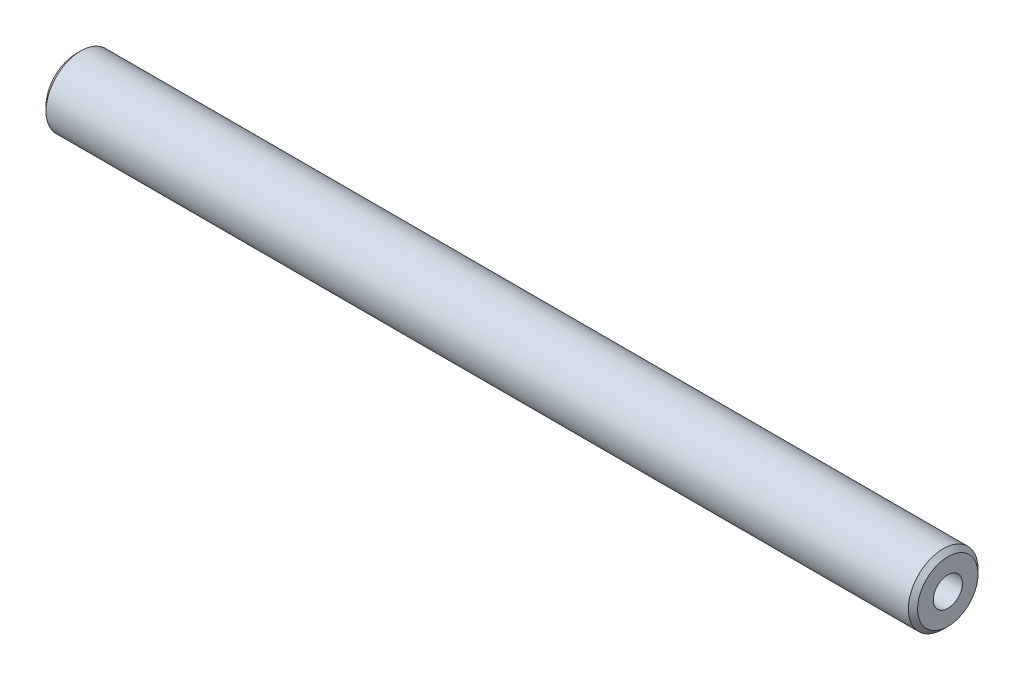
ISO-10303-21;
HEADER;
FILE_DESCRIPTION(('STEP AP214'),'2;1');
FILE_NAME('part.step','',(''),(''),'','','');
FILE_SCHEMA(('AUTOMOTIVE_DESIGN { 1 0 10303 214 1 1 1 1 }'));
ENDSEC;
DATA;
#1=APPLICATION_CONTEXT('core data for automotive mechanical design processes');
#2=APPLICATION_PROTOCOL_DEFINITION('international standard','automotive_design',2000,#1);
#3=PRODUCT_CONTEXT('',#1,'mechanical');
#4=PRODUCT('Part','Part','',(#3));
#5=PRODUCT_RELATED_PRODUCT_CATEGORY('part','',(#4));
#6=PRODUCT_DEFINITION_FORMATION('','',#4);
#7=PRODUCT_DEFINITION_CONTEXT('part definition',#1,'design');
#8=PRODUCT_DEFINITION('design','',#6,#7);
#9=PRODUCT_DEFINITION_SHAPE('','',#8);
#10=(LENGTH_UNIT() NAMED_UNIT(*) SI_UNIT(.MILLI.,.METRE.));
#11=(NAMED_UNIT(*) PLANE_ANGLE_UNIT() SI_UNIT($,.RADIAN.));
#12=(NAMED_UNIT(*) SI_UNIT($,.STERADIAN.) SOLID_ANGLE_UNIT());
#13=UNCERTAINTY_MEASURE_WITH_UNIT(LENGTH_MEASURE(1.E-05),#10,'distance_accuracy_value','');
#14=(GEOMETRIC_REPRESENTATION_CONTEXT(3) GLOBAL_UNCERTAINTY_ASSIGNED_CONTEXT((#13)) GLOBAL_UNIT_ASSIGNED_CONTEXT((#10,
#11,#12)) REPRESENTATION_CONTEXT('',''));
#15=CARTESIAN_POINT('',(0.,0.,0.));
#16=DIRECTION('',(0.,0.,1.));
#17=DIRECTION('',(1.,0.,0.));
#18=AXIS2_PLACEMENT_3D('',#15,#16,#17);
#19=CARTESIAN_POINT('',(0.,3.,0.));
#20=DIRECTION('',(1.,0.,0.));
#21=DIRECTION('',(0.,0.,-1.));
#22=AXIS2_PLACEMENT_3D('',#19,#20,#21);
#23=PLANE('',#22);
#24=CARTESIAN_POINT('',(0.,0.,0.));
#25=DIRECTION('',(-1.,0.,0.));
#26=DIRECTION('',(0.,0.,1.));
#27=AXIS2_PLACEMENT_3D('',#24,#25,#26);
#28=CIRCLE('',#27,1.25);
#29=CARTESIAN_POINT('',(0.,0.,1.25));
#30=VERTEX_POINT('',#29);
#31=EDGE_CURVE('E72',#30,#30,#28,.T.);
#32=ORIENTED_EDGE('',*,*,#31,.F.);
#33=EDGE_LOOP('',(#32));
#34=FACE_BOUND('',#33,.T.);
#35=CARTESIAN_POINT('',(0.,0.,0.));
#36=DIRECTION('',(1.,0.,0.));
#37=DIRECTION('',(0.,0.,-1.));
#38=AXIS2_PLACEMENT_3D('',#35,#36,#37);
#39=CIRCLE('',#38,2.59999999999998);
#40=CARTESIAN_POINT('',(0.,0.,-2.59999999999998));
#41=VERTEX_POINT('',#40);
#42=EDGE_CURVE('E11',#41,#41,#39,.F.);
#43=ORIENTED_EDGE('',*,*,#42,.T.);
#44=EDGE_LOOP('',(#43));
#45=FACE_BOUND('',#44,.T.);
#46=ADVANCED_FACE('F46',(#34,#45),#23,.F.);
#47=CARTESIAN_POINT('',(75.,3.,0.));
#48=DIRECTION('',(-1.,0.,0.));
#49=DIRECTION('',(0.,0.,1.));
#50=AXIS2_PLACEMENT_3D('',#47,#48,#49);
#51=PLANE('',#50);
#52=CARTESIAN_POINT('',(75.,0.,0.));
#53=DIRECTION('',(1.,0.,0.));
#54=DIRECTION('',(0.,0.,-1.));
#55=AXIS2_PLACEMENT_3D('',#52,#53,#54);
#56=CIRCLE('',#55,1.25);
#57=CARTESIAN_POINT('',(75.,0.,-1.25));
#58=VERTEX_POINT('',#57);
#59=EDGE_CURVE('E69',#58,#58,#56,.T.);
#60=ORIENTED_EDGE('',*,*,#59,.F.);
#61=EDGE_LOOP('',(#60));
#62=FACE_BOUND('',#61,.T.);
#63=CARTESIAN_POINT('',(75.,0.,0.));
#64=DIRECTION('',(-1.,0.,0.));
#65=DIRECTION('',(0.,0.,1.));
#66=AXIS2_PLACEMENT_3D('',#63,#64,#65);
#67=CIRCLE('',#66,2.60000000000001);
#68=CARTESIAN_POINT('',(75.,0.,2.60000000000001));
#69=VERTEX_POINT('',#68);
#70=EDGE_CURVE('E54',#69,#69,#67,.F.);
#71=ORIENTED_EDGE('',*,*,#70,.T.);
#72=EDGE_LOOP('',(#71));
#73=FACE_BOUND('',#72,.T.);
#74=ADVANCED_FACE('F88',(#62,#73),#51,.F.);
#75=CARTESIAN_POINT('',(0.,0.,0.));
#76=DIRECTION('',(-1.,0.,0.));
#77=DIRECTION('',(0.,0.,1.));
#78=AXIS2_PLACEMENT_3D('',#75,#76,#77);
#79=CYLINDRICAL_SURFACE('',#78,3.);
#80=CARTESIAN_POINT('',(74.6,0.,0.));
#81=DIRECTION('',(-1.,0.,0.));
#82=DIRECTION('',(0.,0.,1.));
#83=AXIS2_PLACEMENT_3D('',#80,#81,#82);
#84=CIRCLE('',#83,3.);
#85=CARTESIAN_POINT('',(74.6,0.,3.));
#86=VERTEX_POINT('',#85);
#87=EDGE_CURVE('E83',#86,#86,#84,.T.);
#88=ORIENTED_EDGE('',*,*,#87,.T.);
#89=EDGE_LOOP('',(#88));
#90=FACE_BOUND('',#89,.T.);
#91=CARTESIAN_POINT('',(0.400000000000018,0.,0.));
#92=DIRECTION('',(1.,0.,0.));
#93=DIRECTION('',(0.,0.,-1.));
#94=AXIS2_PLACEMENT_3D('',#91,#92,#93);
#95=CIRCLE('',#94,3.);
#96=CARTESIAN_POINT('',(0.400000000000018,0.,-3.));
#97=VERTEX_POINT('',#96);
#98=EDGE_CURVE('E80',#97,#97,#95,.T.);
#99=ORIENTED_EDGE('',*,*,#98,.T.);
#100=EDGE_LOOP('',(#99));
#101=FACE_BOUND('',#100,.T.);
#102=ADVANCED_FACE('F93',(#90,#101),#79,.T.);
#103=CARTESIAN_POINT('',(74.6,0.,0.));
#104=DIRECTION('',(-1.,0.,0.));
#105=DIRECTION('',(0.,0.,1.));
#106=AXIS2_PLACEMENT_3D('',#103,#104,#105);
#107=CONICAL_SURFACE('',#106,3.,0.785398163397454);
#108=ORIENTED_EDGE('',*,*,#70,.F.);
#109=EDGE_LOOP('',(#108));
#110=FACE_BOUND('',#109,.T.);
#111=ORIENTED_EDGE('',*,*,#87,.F.);
#112=EDGE_LOOP('',(#111));
#113=FACE_BOUND('',#112,.T.);
#114=ADVANCED_FACE('F90',(#110,#113),#107,.T.);
#115=CARTESIAN_POINT('',(0.,0.,0.));
#116=DIRECTION('',(1.,0.,0.));
#117=DIRECTION('',(0.,0.,-1.));
#118=AXIS2_PLACEMENT_3D('',#115,#116,#117);
#119=CONICAL_SURFACE('',#118,2.59999999999998,0.785398163397445);
#120=ORIENTED_EDGE('',*,*,#98,.F.);
#121=EDGE_LOOP('',(#120));
#122=FACE_BOUND('',#121,.T.);
#123=ORIENTED_EDGE('',*,*,#42,.F.);
#124=EDGE_LOOP('',(#123));
#125=FACE_BOUND('',#124,.T.);
#126=ADVANCED_FACE('F48',(#122,#125),#119,.T.);
#127=CARTESIAN_POINT('',(8.5,0.,0.));
#128=DIRECTION('',(-1.,0.,0.));
#129=DIRECTION('',(0.,0.,1.));
#130=AXIS2_PLACEMENT_3D('',#127,#128,#129);
#131=CONICAL_SURFACE('',#130,1.25,1.02974425867666);
#132=CARTESIAN_POINT('',(9.25107577378445,0.,0.));
#133=VERTEX_POINT('',#132);
#134=VERTEX_LOOP('',#133);
#135=FACE_BOUND('',#134,.T.);
#136=CARTESIAN_POINT('',(8.5,0.,0.));
#137=DIRECTION('',(-1.,0.,0.));
#138=DIRECTION('',(0.,0.,1.));
#139=AXIS2_PLACEMENT_3D('',#136,#137,#138);
#140=CIRCLE('',#139,1.25);
#141=CARTESIAN_POINT('',(8.5,0.,1.25));
#142=VERTEX_POINT('',#141);
#143=EDGE_CURVE('E77',#142,#142,#140,.T.);
#144=ORIENTED_EDGE('',*,*,#143,.T.);
#145=EDGE_LOOP('',(#144));
#146=FACE_BOUND('',#145,.T.);
#147=ADVANCED_FACE('F103',(#135,#146),#131,.F.);
#148=CARTESIAN_POINT('',(0.,0.,0.));
#149=DIRECTION('',(-1.,0.,0.));
#150=DIRECTION('',(0.,0.,1.));
#151=AXIS2_PLACEMENT_3D('',#148,#149,#150);
#152=CYLINDRICAL_SURFACE('',#151,1.25);
#153=ORIENTED_EDGE('',*,*,#143,.F.);
#154=EDGE_LOOP('',(#153));
#155=FACE_BOUND('',#154,.T.);
#156=ORIENTED_EDGE('',*,*,#31,.T.);
#157=EDGE_LOOP('',(#156));
#158=FACE_BOUND('',#157,.T.);
#159=ADVANCED_FACE('F118',(#155,#158),#152,.F.);
#160=CARTESIAN_POINT('',(75.,0.,0.));
#161=DIRECTION('',(1.,0.,0.));
#162=DIRECTION('',(0.,0.,-1.));
#163=AXIS2_PLACEMENT_3D('',#160,#161,#162);
#164=CYLINDRICAL_SURFACE('',#163,1.25);
#165=CARTESIAN_POINT('',(66.5,0.,0.));
#166=DIRECTION('',(1.,0.,0.));
#167=DIRECTION('',(0.,0.,-1.));
#168=AXIS2_PLACEMENT_3D('',#165,#166,#167);
#169=CIRCLE('',#168,1.25);
#170=CARTESIAN_POINT('',(66.5,0.,-1.25));
#171=VERTEX_POINT('',#170);
#172=EDGE_CURVE('E67',#171,#171,#169,.T.);
#173=ORIENTED_EDGE('',*,*,#172,.F.);
#174=EDGE_LOOP('',(#173));
#175=FACE_BOUND('',#174,.T.);
#176=ORIENTED_EDGE('',*,*,#59,.T.);
#177=EDGE_LOOP('',(#176));
#178=FACE_BOUND('',#177,.T.);
#179=ADVANCED_FACE('F63',(#175,#178),#164,.F.);
#180=CARTESIAN_POINT('',(66.5,0.,0.));
#181=DIRECTION('',(1.,0.,0.));
#182=DIRECTION('',(0.,0.,-1.));
#183=AXIS2_PLACEMENT_3D('',#180,#181,#182);
#184=CONICAL_SURFACE('',#183,1.25,1.02974425867665);
#185=CARTESIAN_POINT('',(65.7489242262155,0.,0.));
#186=VERTEX_POINT('',#185);
#187=VERTEX_LOOP('',#186);
#188=FACE_BOUND('',#187,.T.);
#189=ORIENTED_EDGE('',*,*,#172,.T.);
#190=EDGE_LOOP('',(#189));
#191=FACE_BOUND('',#190,.T.);
#192=ADVANCED_FACE('F60',(#188,#191),#184,.F.);
#193=CLOSED_SHELL('',(#46,#74,#102,#114,#126,#147,#159,#179,#192));
#194=MANIFOLD_SOLID_BREP('B2',#193);
#195=ADVANCED_BREP_SHAPE_REPRESENTATION('',(#18,#194),#14);
#196=SHAPE_DEFINITION_REPRESENTATION(#9,#195);
ENDSEC;
END-ISO-10303-21;
